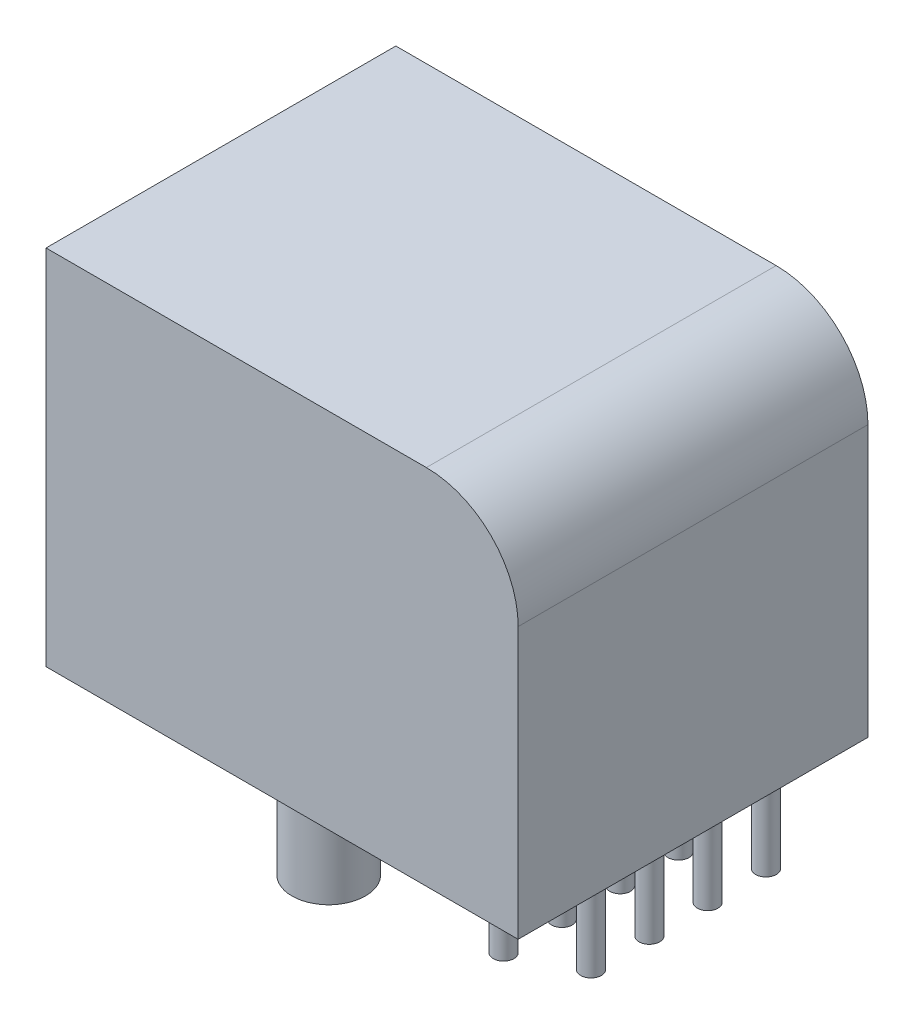
ISO-10303-21;
HEADER;
FILE_DESCRIPTION(('STEP AP214'),'2;1');
FILE_NAME('part.step','',(''),(''),'','','');
FILE_SCHEMA(('AUTOMOTIVE_DESIGN { 1 0 10303 214 1 1 1 1 }'));
ENDSEC;
DATA;
#1=APPLICATION_CONTEXT('core data for automotive mechanical design processes');
#2=APPLICATION_PROTOCOL_DEFINITION('international standard','automotive_design',2000,#1);
#3=PRODUCT_CONTEXT('',#1,'mechanical');
#4=PRODUCT('Part','Part','',(#3));
#5=PRODUCT_RELATED_PRODUCT_CATEGORY('part','',(#4));
#6=PRODUCT_DEFINITION_FORMATION('','',#4);
#7=PRODUCT_DEFINITION_CONTEXT('part definition',#1,'design');
#8=PRODUCT_DEFINITION('design','',#6,#7);
#9=PRODUCT_DEFINITION_SHAPE('','',#8);
#10=(LENGTH_UNIT() NAMED_UNIT(*) SI_UNIT(.MILLI.,.METRE.));
#11=(NAMED_UNIT(*) PLANE_ANGLE_UNIT() SI_UNIT($,.RADIAN.));
#12=(NAMED_UNIT(*) SI_UNIT($,.STERADIAN.) SOLID_ANGLE_UNIT());
#13=UNCERTAINTY_MEASURE_WITH_UNIT(LENGTH_MEASURE(1.E-05),#10,'distance_accuracy_value','');
#14=(GEOMETRIC_REPRESENTATION_CONTEXT(3) GLOBAL_UNCERTAINTY_ASSIGNED_CONTEXT((#13)) GLOBAL_UNIT_ASSIGNED_CONTEXT((#10,
#11,#12)) REPRESENTATION_CONTEXT('',''));
#15=CARTESIAN_POINT('',(0.,0.,0.));
#16=DIRECTION('',(0.,0.,1.));
#17=DIRECTION('',(1.,0.,0.));
#18=AXIS2_PLACEMENT_3D('',#15,#16,#17);
#19=CARTESIAN_POINT('',(-10.285,-7.9,15.24));
#20=DIRECTION('',(-1.,0.,0.));
#21=DIRECTION('',(0.,0.,1.));
#22=AXIS2_PLACEMENT_3D('',#19,#20,#21);
#23=PLANE('',#22);
#24=DIRECTION('',(0.,1.,0.));
#25=VECTOR('',#24,1.);
#26=CARTESIAN_POINT('',(-10.285,-7.9,0.));
#27=LINE('',#26,#25);
#28=CARTESIAN_POINT('',(-10.285,-7.9,0.));
#29=VERTEX_POINT('',#28);
#30=CARTESIAN_POINT('',(-10.285,7.9,0.));
#31=VERTEX_POINT('',#30);
#32=EDGE_CURVE('E119',#29,#31,#27,.T.);
#33=ORIENTED_EDGE('',*,*,#32,.F.);
#34=DIRECTION('',(0.,0.,-1.));
#35=VECTOR('',#34,1.);
#36=CARTESIAN_POINT('',(-10.285,-7.9,15.24));
#37=LINE('',#36,#35);
#38=CARTESIAN_POINT('',(-10.285,-7.9,15.24));
#39=VERTEX_POINT('',#38);
#40=EDGE_CURVE('E107',#39,#29,#37,.T.);
#41=ORIENTED_EDGE('',*,*,#40,.F.);
#42=DIRECTION('',(0.,1.,0.));
#43=VECTOR('',#42,1.);
#44=CARTESIAN_POINT('',(-10.285,-7.9,15.24));
#45=LINE('',#44,#43);
#46=CARTESIAN_POINT('',(-10.285,7.9,15.24));
#47=VERTEX_POINT('',#46);
#48=EDGE_CURVE('E102',#39,#47,#45,.T.);
#49=ORIENTED_EDGE('',*,*,#48,.T.);
#50=DIRECTION('',(0.,0.,-1.));
#51=VECTOR('',#50,1.);
#52=CARTESIAN_POINT('',(-10.285,7.9,15.24));
#53=LINE('',#52,#51);
#54=EDGE_CURVE('E85',#47,#31,#53,.T.);
#55=ORIENTED_EDGE('',*,*,#54,.T.);
#56=EDGE_LOOP('',(#33,#41,#49,#55));
#57=FACE_BOUND('',#56,.T.);
#58=ADVANCED_FACE('F36',(#57),#23,.T.);
#59=CARTESIAN_POINT('',(-10.285,-7.9,15.24));
#60=DIRECTION('',(0.,1.,0.));
#61=DIRECTION('',(0.,0.,1.));
#62=AXIS2_PLACEMENT_3D('',#59,#60,#61);
#63=PLANE('',#62);
#64=CARTESIAN_POINT('',(6.475,-7.9,12.065));
#65=DIRECTION('',(0.,1.,0.));
#66=DIRECTION('',(0.,0.,1.));
#67=AXIS2_PLACEMENT_3D('',#64,#65,#66);
#68=CIRCLE('',#67,0.45);
#69=CARTESIAN_POINT('',(6.475,-7.9,12.515));
#70=VERTEX_POINT('',#69);
#71=EDGE_CURVE('E11',#70,#70,#68,.F.);
#72=ORIENTED_EDGE('',*,*,#71,.F.);
#73=EDGE_LOOP('',(#72));
#74=FACE_BOUND('',#73,.T.);
#75=CARTESIAN_POINT('',(6.475,-7.9,9.525));
#76=DIRECTION('',(0.,1.,0.));
#77=DIRECTION('',(0.,0.,1.));
#78=AXIS2_PLACEMENT_3D('',#75,#76,#77);
#79=CIRCLE('',#78,0.45);
#80=CARTESIAN_POINT('',(6.475,-7.9,9.975));
#81=VERTEX_POINT('',#80);
#82=EDGE_CURVE('E44',#81,#81,#79,.F.);
#83=ORIENTED_EDGE('',*,*,#82,.F.);
#84=EDGE_LOOP('',(#83));
#85=FACE_BOUND('',#84,.T.);
#86=CARTESIAN_POINT('',(6.475,-7.9,4.445));
#87=DIRECTION('',(0.,1.,0.));
#88=DIRECTION('',(0.,0.,1.));
#89=AXIS2_PLACEMENT_3D('',#86,#87,#88);
#90=CIRCLE('',#89,0.45);
#91=CARTESIAN_POINT('',(6.475,-7.9,4.895));
#92=VERTEX_POINT('',#91);
#93=EDGE_CURVE('E152',#92,#92,#90,.F.);
#94=ORIENTED_EDGE('',*,*,#93,.F.);
#95=EDGE_LOOP('',(#94));
#96=FACE_BOUND('',#95,.T.);
#97=CARTESIAN_POINT('',(9.015,-7.9,10.795));
#98=DIRECTION('',(0.,1.,0.));
#99=DIRECTION('',(0.,0.,1.));
#100=AXIS2_PLACEMENT_3D('',#97,#98,#99);
#101=CIRCLE('',#100,0.45);
#102=CARTESIAN_POINT('',(9.015,-7.9,11.245));
#103=VERTEX_POINT('',#102);
#104=EDGE_CURVE('E149',#103,#103,#101,.F.);
#105=ORIENTED_EDGE('',*,*,#104,.F.);
#106=EDGE_LOOP('',(#105));
#107=FACE_BOUND('',#106,.T.);
#108=CARTESIAN_POINT('',(9.015,-7.9,3.175));
#109=DIRECTION('',(0.,1.,0.));
#110=DIRECTION('',(0.,0.,1.));
#111=AXIS2_PLACEMENT_3D('',#108,#109,#110);
#112=CIRCLE('',#111,0.45);
#113=CARTESIAN_POINT('',(9.015,-7.9,3.625));
#114=VERTEX_POINT('',#113);
#115=EDGE_CURVE('E146',#114,#114,#112,.F.);
#116=ORIENTED_EDGE('',*,*,#115,.F.);
#117=EDGE_LOOP('',(#116));
#118=FACE_BOUND('',#117,.T.);
#119=CARTESIAN_POINT('',(9.015,-7.9,5.715));
#120=DIRECTION('',(0.,1.,0.));
#121=DIRECTION('',(0.,0.,1.));
#122=AXIS2_PLACEMENT_3D('',#119,#120,#121);
#123=CIRCLE('',#122,0.45);
#124=CARTESIAN_POINT('',(9.015,-7.9,6.165));
#125=VERTEX_POINT('',#124);
#126=EDGE_CURVE('E143',#125,#125,#123,.F.);
#127=ORIENTED_EDGE('',*,*,#126,.F.);
#128=EDGE_LOOP('',(#127));
#129=FACE_BOUND('',#128,.T.);
#130=CARTESIAN_POINT('',(9.015,-7.9,8.255));
#131=DIRECTION('',(0.,1.,0.));
#132=DIRECTION('',(0.,0.,1.));
#133=AXIS2_PLACEMENT_3D('',#130,#131,#132);
#134=CIRCLE('',#133,0.45);
#135=CARTESIAN_POINT('',(9.015,-7.9,8.705));
#136=VERTEX_POINT('',#135);
#137=EDGE_CURVE('E140',#136,#136,#134,.F.);
#138=ORIENTED_EDGE('',*,*,#137,.F.);
#139=EDGE_LOOP('',(#138));
#140=FACE_BOUND('',#139,.T.);
#141=CARTESIAN_POINT('',(6.475,-7.9,6.985));
#142=DIRECTION('',(0.,1.,0.));
#143=DIRECTION('',(0.,0.,1.));
#144=AXIS2_PLACEMENT_3D('',#141,#142,#143);
#145=CIRCLE('',#144,0.45);
#146=CARTESIAN_POINT('',(6.475,-7.9,7.435));
#147=VERTEX_POINT('',#146);
#148=EDGE_CURVE('E137',#147,#147,#145,.F.);
#149=ORIENTED_EDGE('',*,*,#148,.F.);
#150=EDGE_LOOP('',(#149));
#151=FACE_BOUND('',#150,.T.);
#152=CARTESIAN_POINT('',(0.125000000000002,-7.9,13.335));
#153=DIRECTION('',(0.,1.,0.));
#154=DIRECTION('',(0.,0.,1.));
#155=AXIS2_PLACEMENT_3D('',#152,#153,#154);
#156=CIRCLE('',#155,1.6);
#157=CARTESIAN_POINT('',(0.125000000000002,-7.9,14.935));
#158=VERTEX_POINT('',#157);
#159=EDGE_CURVE('E134',#158,#158,#156,.F.);
#160=ORIENTED_EDGE('',*,*,#159,.F.);
#161=EDGE_LOOP('',(#160));
#162=FACE_BOUND('',#161,.T.);
#163=CARTESIAN_POINT('',(0.125000000000002,-7.9,1.905));
#164=DIRECTION('',(0.,1.,0.));
#165=DIRECTION('',(0.,0.,1.));
#166=AXIS2_PLACEMENT_3D('',#163,#164,#165);
#167=CIRCLE('',#166,1.6);
#168=CARTESIAN_POINT('',(0.125000000000002,-7.9,3.505));
#169=VERTEX_POINT('',#168);
#170=EDGE_CURVE('E131',#169,#169,#167,.F.);
#171=ORIENTED_EDGE('',*,*,#170,.F.);
#172=EDGE_LOOP('',(#171));
#173=FACE_BOUND('',#172,.T.);
#174=DIRECTION('',(1.,0.,0.));
#175=VECTOR('',#174,1.);
#176=CARTESIAN_POINT('',(-10.285,-7.9,0.));
#177=LINE('',#176,#175);
#178=CARTESIAN_POINT('',(10.285,-7.9,0.));
#179=VERTEX_POINT('',#178);
#180=EDGE_CURVE('E109',#29,#179,#177,.T.);
#181=ORIENTED_EDGE('',*,*,#180,.T.);
#182=DIRECTION('',(0.,0.,-1.));
#183=VECTOR('',#182,1.);
#184=CARTESIAN_POINT('',(10.285,-7.9,15.24));
#185=LINE('',#184,#183);
#186=CARTESIAN_POINT('',(10.285,-7.9,15.24));
#187=VERTEX_POINT('',#186);
#188=EDGE_CURVE('E96',#187,#179,#185,.T.);
#189=ORIENTED_EDGE('',*,*,#188,.F.);
#190=DIRECTION('',(1.,0.,0.));
#191=VECTOR('',#190,1.);
#192=CARTESIAN_POINT('',(-10.285,-7.9,15.24));
#193=LINE('',#192,#191);
#194=EDGE_CURVE('E97',#39,#187,#193,.T.);
#195=ORIENTED_EDGE('',*,*,#194,.F.);
#196=ORIENTED_EDGE('',*,*,#40,.T.);
#197=EDGE_LOOP('',(#181,#189,#195,#196));
#198=FACE_BOUND('',#197,.T.);
#199=ADVANCED_FACE('F159',(#74,#85,#96,#107,#118,#129,#140,#151,#162,#173,#198),#63,.F.);
#200=CARTESIAN_POINT('',(10.285,-7.9,15.24));
#201=DIRECTION('',(-1.,0.,0.));
#202=DIRECTION('',(0.,0.,1.));
#203=AXIS2_PLACEMENT_3D('',#200,#201,#202);
#204=PLANE('',#203);
#205=DIRECTION('',(0.,1.,0.));
#206=VECTOR('',#205,1.);
#207=CARTESIAN_POINT('',(10.285,-7.9,0.));
#208=LINE('',#207,#206);
#209=CARTESIAN_POINT('',(10.285,3.9,0.));
#210=VERTEX_POINT('',#209);
#211=EDGE_CURVE('E111',#179,#210,#208,.T.);
#212=ORIENTED_EDGE('',*,*,#211,.T.);
#213=DIRECTION('',(0.,0.,-1.));
#214=VECTOR('',#213,1.);
#215=CARTESIAN_POINT('',(10.285,3.9,15.24));
#216=LINE('',#215,#214);
#217=CARTESIAN_POINT('',(10.285,3.9,15.24));
#218=VERTEX_POINT('',#217);
#219=EDGE_CURVE('E51',#210,#218,#216,.F.);
#220=ORIENTED_EDGE('',*,*,#219,.T.);
#221=DIRECTION('',(0.,1.,0.));
#222=VECTOR('',#221,1.);
#223=CARTESIAN_POINT('',(10.285,-7.9,15.24));
#224=LINE('',#223,#222);
#225=EDGE_CURVE('E105',#187,#218,#224,.T.);
#226=ORIENTED_EDGE('',*,*,#225,.F.);
#227=ORIENTED_EDGE('',*,*,#188,.T.);
#228=EDGE_LOOP('',(#212,#220,#226,#227));
#229=FACE_BOUND('',#228,.T.);
#230=ADVANCED_FACE('F162',(#229),#204,.F.);
#231=CARTESIAN_POINT('',(-10.285,7.9,15.24));
#232=DIRECTION('',(0.,1.,0.));
#233=DIRECTION('',(0.,0.,1.));
#234=AXIS2_PLACEMENT_3D('',#231,#232,#233);
#235=PLANE('',#234);
#236=DIRECTION('',(1.,0.,0.));
#237=VECTOR('',#236,1.);
#238=CARTESIAN_POINT('',(-10.285,7.9,15.24));
#239=LINE('',#238,#237);
#240=CARTESIAN_POINT('',(6.285,7.9,15.24));
#241=VERTEX_POINT('',#240);
#242=EDGE_CURVE('E89',#47,#241,#239,.T.);
#243=ORIENTED_EDGE('',*,*,#242,.T.);
#244=DIRECTION('',(0.,0.,-1.));
#245=VECTOR('',#244,1.);
#246=CARTESIAN_POINT('',(6.285,7.9,0.));
#247=LINE('',#246,#245);
#248=CARTESIAN_POINT('',(6.285,7.9,0.));
#249=VERTEX_POINT('',#248);
#250=EDGE_CURVE('E124',#241,#249,#247,.T.);
#251=ORIENTED_EDGE('',*,*,#250,.T.);
#252=DIRECTION('',(1.,0.,0.));
#253=VECTOR('',#252,1.);
#254=CARTESIAN_POINT('',(-10.285,7.9,0.));
#255=LINE('',#254,#253);
#256=EDGE_CURVE('E91',#31,#249,#255,.T.);
#257=ORIENTED_EDGE('',*,*,#256,.F.);
#258=ORIENTED_EDGE('',*,*,#54,.F.);
#259=EDGE_LOOP('',(#243,#251,#257,#258));
#260=FACE_BOUND('',#259,.T.);
#261=ADVANCED_FACE('F87',(#260),#235,.T.);
#262=CARTESIAN_POINT('',(0.,0.,15.24));
#263=DIRECTION('',(0.,0.,-1.));
#264=DIRECTION('',(-1.,0.,0.));
#265=AXIS2_PLACEMENT_3D('',#262,#263,#264);
#266=PLANE('',#265);
#267=ORIENTED_EDGE('',*,*,#225,.T.);
#268=CARTESIAN_POINT('',(6.285,3.9,15.24));
#269=DIRECTION('',(0.,0.,-1.));
#270=DIRECTION('',(-1.,0.,0.));
#271=AXIS2_PLACEMENT_3D('',#268,#269,#270);
#272=CIRCLE('',#271,4.);
#273=EDGE_CURVE('E104',#218,#241,#272,.F.);
#274=ORIENTED_EDGE('',*,*,#273,.T.);
#275=ORIENTED_EDGE('',*,*,#242,.F.);
#276=ORIENTED_EDGE('',*,*,#48,.F.);
#277=ORIENTED_EDGE('',*,*,#194,.T.);
#278=EDGE_LOOP('',(#267,#274,#275,#276,#277));
#279=FACE_BOUND('',#278,.T.);
#280=ADVANCED_FACE('F101',(#279),#266,.F.);
#281=CARTESIAN_POINT('',(0.,0.,0.));
#282=DIRECTION('',(0.,0.,-1.));
#283=DIRECTION('',(-1.,0.,0.));
#284=AXIS2_PLACEMENT_3D('',#281,#282,#283);
#285=PLANE('',#284);
#286=ORIENTED_EDGE('',*,*,#256,.T.);
#287=CARTESIAN_POINT('',(6.285,3.9,0.));
#288=DIRECTION('',(0.,0.,-1.));
#289=DIRECTION('',(-1.,0.,0.));
#290=AXIS2_PLACEMENT_3D('',#287,#288,#289);
#291=CIRCLE('',#290,4.);
#292=EDGE_CURVE('E59',#249,#210,#291,.T.);
#293=ORIENTED_EDGE('',*,*,#292,.T.);
#294=ORIENTED_EDGE('',*,*,#211,.F.);
#295=ORIENTED_EDGE('',*,*,#180,.F.);
#296=ORIENTED_EDGE('',*,*,#32,.T.);
#297=EDGE_LOOP('',(#286,#293,#294,#295,#296));
#298=FACE_BOUND('',#297,.T.);
#299=ADVANCED_FACE('F183',(#298),#285,.T.);
#300=CARTESIAN_POINT('',(6.285,3.9,15.24));
#301=DIRECTION('',(0.,0.,1.));
#302=DIRECTION('',(1.,0.,0.));
#303=AXIS2_PLACEMENT_3D('',#300,#301,#302);
#304=CYLINDRICAL_SURFACE('',#303,4.);
#305=ORIENTED_EDGE('',*,*,#273,.F.);
#306=ORIENTED_EDGE('',*,*,#219,.F.);
#307=ORIENTED_EDGE('',*,*,#292,.F.);
#308=ORIENTED_EDGE('',*,*,#250,.F.);
#309=EDGE_LOOP('',(#305,#306,#307,#308));
#310=FACE_BOUND('',#309,.T.);
#311=ADVANCED_FACE('F38',(#310),#304,.T.);
#312=CARTESIAN_POINT('',(0.125000000000002,-11.5,1.905));
#313=DIRECTION('',(0.,1.,0.));
#314=DIRECTION('',(0.,0.,1.));
#315=AXIS2_PLACEMENT_3D('',#312,#313,#314);
#316=CYLINDRICAL_SURFACE('',#315,1.6);
#317=CARTESIAN_POINT('',(0.125000000000002,-11.5,1.905));
#318=DIRECTION('',(0.,-1.,0.));
#319=DIRECTION('',(0.,0.,-1.));
#320=AXIS2_PLACEMENT_3D('',#317,#318,#319);
#321=CIRCLE('',#320,1.6);
#322=CARTESIAN_POINT('',(0.125000000000002,-11.5,0.305));
#323=VERTEX_POINT('',#322);
#324=EDGE_CURVE('E114',#323,#323,#321,.T.);
#325=ORIENTED_EDGE('',*,*,#324,.F.);
#326=EDGE_LOOP('',(#325));
#327=FACE_BOUND('',#326,.T.);
#328=ORIENTED_EDGE('',*,*,#170,.T.);
#329=EDGE_LOOP('',(#328));
#330=FACE_BOUND('',#329,.T.);
#331=ADVANCED_FACE('F190',(#327,#330),#316,.T.);
#332=CARTESIAN_POINT('',(0.,-11.5,0.));
#333=DIRECTION('',(0.,-1.,0.));
#334=DIRECTION('',(0.,0.,-1.));
#335=AXIS2_PLACEMENT_3D('',#332,#333,#334);
#336=PLANE('',#335);
#337=ORIENTED_EDGE('',*,*,#324,.T.);
#338=EDGE_LOOP('',(#337));
#339=FACE_BOUND('',#338,.T.);
#340=ADVANCED_FACE('F231',(#339),#336,.T.);
#341=CARTESIAN_POINT('',(0.125000000000002,-11.5,13.335));
#342=DIRECTION('',(0.,1.,0.));
#343=DIRECTION('',(0.,0.,1.));
#344=AXIS2_PLACEMENT_3D('',#341,#342,#343);
#345=CYLINDRICAL_SURFACE('',#344,1.6);
#346=CARTESIAN_POINT('',(0.125000000000002,-11.5,13.335));
#347=DIRECTION('',(0.,-1.,0.));
#348=DIRECTION('',(0.,0.,-1.));
#349=AXIS2_PLACEMENT_3D('',#346,#347,#348);
#350=CIRCLE('',#349,1.6);
#351=CARTESIAN_POINT('',(0.125000000000002,-11.5,11.735));
#352=VERTEX_POINT('',#351);
#353=EDGE_CURVE('E478',#352,#352,#350,.T.);
#354=ORIENTED_EDGE('',*,*,#353,.F.);
#355=EDGE_LOOP('',(#354));
#356=FACE_BOUND('',#355,.T.);
#357=ORIENTED_EDGE('',*,*,#159,.T.);
#358=EDGE_LOOP('',(#357));
#359=FACE_BOUND('',#358,.T.);
#360=ADVANCED_FACE('F241',(#356,#359),#345,.T.);
#361=CARTESIAN_POINT('',(0.125000000000002,-11.5,13.335));
#362=DIRECTION('',(0.,-1.,0.));
#363=DIRECTION('',(0.,0.,-1.));
#364=AXIS2_PLACEMENT_3D('',#361,#362,#363);
#365=PLANE('',#364);
#366=ORIENTED_EDGE('',*,*,#353,.T.);
#367=EDGE_LOOP('',(#366));
#368=FACE_BOUND('',#367,.T.);
#369=ADVANCED_FACE('F251',(#368),#365,.T.);
#370=CARTESIAN_POINT('',(6.475,-11.9,6.985));
#371=DIRECTION('',(0.,1.,0.));
#372=DIRECTION('',(0.,0.,1.));
#373=AXIS2_PLACEMENT_3D('',#370,#371,#372);
#374=CYLINDRICAL_SURFACE('',#373,0.45);
#375=CARTESIAN_POINT('',(6.475,-11.9,6.985));
#376=DIRECTION('',(0.,-1.,0.));
#377=DIRECTION('',(0.,0.,-1.));
#378=AXIS2_PLACEMENT_3D('',#375,#376,#377);
#379=CIRCLE('',#378,0.45);
#380=CARTESIAN_POINT('',(6.475,-11.9,6.535));
#381=VERTEX_POINT('',#380);
#382=EDGE_CURVE('E476',#381,#381,#379,.T.);
#383=ORIENTED_EDGE('',*,*,#382,.F.);
#384=EDGE_LOOP('',(#383));
#385=FACE_BOUND('',#384,.T.);
#386=ORIENTED_EDGE('',*,*,#148,.T.);
#387=EDGE_LOOP('',(#386));
#388=FACE_BOUND('',#387,.T.);
#389=ADVANCED_FACE('F261',(#385,#388),#374,.T.);
#390=CARTESIAN_POINT('',(0.,-11.9,0.));
#391=DIRECTION('',(0.,-1.,0.));
#392=DIRECTION('',(0.,0.,-1.));
#393=AXIS2_PLACEMENT_3D('',#390,#391,#392);
#394=PLANE('',#393);
#395=ORIENTED_EDGE('',*,*,#382,.T.);
#396=EDGE_LOOP('',(#395));
#397=FACE_BOUND('',#396,.T.);
#398=ADVANCED_FACE('F271',(#397),#394,.T.);
#399=CARTESIAN_POINT('',(9.015,-11.9,8.255));
#400=DIRECTION('',(0.,1.,0.));
#401=DIRECTION('',(0.,0.,1.));
#402=AXIS2_PLACEMENT_3D('',#399,#400,#401);
#403=CYLINDRICAL_SURFACE('',#402,0.45);
#404=CARTESIAN_POINT('',(9.015,-11.9,8.255));
#405=DIRECTION('',(0.,-1.,0.));
#406=DIRECTION('',(0.,0.,-1.));
#407=AXIS2_PLACEMENT_3D('',#404,#405,#406);
#408=CIRCLE('',#407,0.45);
#409=CARTESIAN_POINT('',(9.015,-11.9,7.805));
#410=VERTEX_POINT('',#409);
#411=EDGE_CURVE('E473',#410,#410,#408,.T.);
#412=ORIENTED_EDGE('',*,*,#411,.F.);
#413=EDGE_LOOP('',(#412));
#414=FACE_BOUND('',#413,.T.);
#415=ORIENTED_EDGE('',*,*,#137,.T.);
#416=EDGE_LOOP('',(#415));
#417=FACE_BOUND('',#416,.T.);
#418=ADVANCED_FACE('F281',(#414,#417),#403,.T.);
#419=CARTESIAN_POINT('',(9.015,-11.9,8.255));
#420=DIRECTION('',(0.,-1.,0.));
#421=DIRECTION('',(0.,0.,-1.));
#422=AXIS2_PLACEMENT_3D('',#419,#420,#421);
#423=PLANE('',#422);
#424=ORIENTED_EDGE('',*,*,#411,.T.);
#425=EDGE_LOOP('',(#424));
#426=FACE_BOUND('',#425,.T.);
#427=ADVANCED_FACE('F291',(#426),#423,.T.);
#428=CARTESIAN_POINT('',(9.015,-11.9,5.715));
#429=DIRECTION('',(0.,1.,0.));
#430=DIRECTION('',(0.,0.,1.));
#431=AXIS2_PLACEMENT_3D('',#428,#429,#430);
#432=CYLINDRICAL_SURFACE('',#431,0.45);
#433=CARTESIAN_POINT('',(9.015,-11.9,5.715));
#434=DIRECTION('',(0.,-1.,0.));
#435=DIRECTION('',(0.,0.,-1.));
#436=AXIS2_PLACEMENT_3D('',#433,#434,#435);
#437=CIRCLE('',#436,0.45);
#438=CARTESIAN_POINT('',(9.015,-11.9,5.265));
#439=VERTEX_POINT('',#438);
#440=EDGE_CURVE('E470',#439,#439,#437,.T.);
#441=ORIENTED_EDGE('',*,*,#440,.F.);
#442=EDGE_LOOP('',(#441));
#443=FACE_BOUND('',#442,.T.);
#444=ORIENTED_EDGE('',*,*,#126,.T.);
#445=EDGE_LOOP('',(#444));
#446=FACE_BOUND('',#445,.T.);
#447=ADVANCED_FACE('F301',(#443,#446),#432,.T.);
#448=CARTESIAN_POINT('',(9.015,-11.9,5.715));
#449=DIRECTION('',(0.,-1.,0.));
#450=DIRECTION('',(0.,0.,-1.));
#451=AXIS2_PLACEMENT_3D('',#448,#449,#450);
#452=PLANE('',#451);
#453=ORIENTED_EDGE('',*,*,#440,.T.);
#454=EDGE_LOOP('',(#453));
#455=FACE_BOUND('',#454,.T.);
#456=ADVANCED_FACE('F312',(#455),#452,.T.);
#457=CARTESIAN_POINT('',(9.015,-11.9,3.175));
#458=DIRECTION('',(0.,1.,0.));
#459=DIRECTION('',(0.,0.,1.));
#460=AXIS2_PLACEMENT_3D('',#457,#458,#459);
#461=CYLINDRICAL_SURFACE('',#460,0.45);
#462=CARTESIAN_POINT('',(9.015,-11.9,3.175));
#463=DIRECTION('',(0.,-1.,0.));
#464=DIRECTION('',(0.,0.,-1.));
#465=AXIS2_PLACEMENT_3D('',#462,#463,#464);
#466=CIRCLE('',#465,0.45);
#467=CARTESIAN_POINT('',(9.015,-11.9,2.725));
#468=VERTEX_POINT('',#467);
#469=EDGE_CURVE('E467',#468,#468,#466,.T.);
#470=ORIENTED_EDGE('',*,*,#469,.F.);
#471=EDGE_LOOP('',(#470));
#472=FACE_BOUND('',#471,.T.);
#473=ORIENTED_EDGE('',*,*,#115,.T.);
#474=EDGE_LOOP('',(#473));
#475=FACE_BOUND('',#474,.T.);
#476=ADVANCED_FACE('F325',(#472,#475),#461,.T.);
#477=CARTESIAN_POINT('',(9.015,-11.9,3.175));
#478=DIRECTION('',(0.,-1.,0.));
#479=DIRECTION('',(0.,0.,-1.));
#480=AXIS2_PLACEMENT_3D('',#477,#478,#479);
#481=PLANE('',#480);
#482=ORIENTED_EDGE('',*,*,#469,.T.);
#483=EDGE_LOOP('',(#482));
#484=FACE_BOUND('',#483,.T.);
#485=ADVANCED_FACE('F336',(#484),#481,.T.);
#486=CARTESIAN_POINT('',(9.015,-11.9,10.795));
#487=DIRECTION('',(0.,1.,0.));
#488=DIRECTION('',(0.,0.,1.));
#489=AXIS2_PLACEMENT_3D('',#486,#487,#488);
#490=CYLINDRICAL_SURFACE('',#489,0.45);
#491=CARTESIAN_POINT('',(9.015,-11.9,10.795));
#492=DIRECTION('',(0.,-1.,0.));
#493=DIRECTION('',(0.,0.,-1.));
#494=AXIS2_PLACEMENT_3D('',#491,#492,#493);
#495=CIRCLE('',#494,0.45);
#496=CARTESIAN_POINT('',(9.015,-11.9,10.345));
#497=VERTEX_POINT('',#496);
#498=EDGE_CURVE('E464',#497,#497,#495,.T.);
#499=ORIENTED_EDGE('',*,*,#498,.F.);
#500=EDGE_LOOP('',(#499));
#501=FACE_BOUND('',#500,.T.);
#502=ORIENTED_EDGE('',*,*,#104,.T.);
#503=EDGE_LOOP('',(#502));
#504=FACE_BOUND('',#503,.T.);
#505=ADVANCED_FACE('F347',(#501,#504),#490,.T.);
#506=CARTESIAN_POINT('',(9.015,-11.9,10.795));
#507=DIRECTION('',(0.,-1.,0.));
#508=DIRECTION('',(0.,0.,-1.));
#509=AXIS2_PLACEMENT_3D('',#506,#507,#508);
#510=PLANE('',#509);
#511=ORIENTED_EDGE('',*,*,#498,.T.);
#512=EDGE_LOOP('',(#511));
#513=FACE_BOUND('',#512,.T.);
#514=ADVANCED_FACE('F357',(#513),#510,.T.);
#515=CARTESIAN_POINT('',(6.475,-11.9,4.445));
#516=DIRECTION('',(0.,1.,0.));
#517=DIRECTION('',(0.,0.,1.));
#518=AXIS2_PLACEMENT_3D('',#515,#516,#517);
#519=CYLINDRICAL_SURFACE('',#518,0.45);
#520=CARTESIAN_POINT('',(6.475,-11.9,4.445));
#521=DIRECTION('',(0.,-1.,0.));
#522=DIRECTION('',(0.,0.,-1.));
#523=AXIS2_PLACEMENT_3D('',#520,#521,#522);
#524=CIRCLE('',#523,0.45);
#525=CARTESIAN_POINT('',(6.475,-11.9,3.995));
#526=VERTEX_POINT('',#525);
#527=EDGE_CURVE('E459',#526,#526,#524,.T.);
#528=ORIENTED_EDGE('',*,*,#527,.F.);
#529=EDGE_LOOP('',(#528));
#530=FACE_BOUND('',#529,.T.);
#531=ORIENTED_EDGE('',*,*,#93,.T.);
#532=EDGE_LOOP('',(#531));
#533=FACE_BOUND('',#532,.T.);
#534=ADVANCED_FACE('F367',(#530,#533),#519,.T.);
#535=CARTESIAN_POINT('',(0.,-11.9,-2.54));
#536=DIRECTION('',(0.,-1.,0.));
#537=DIRECTION('',(0.,0.,-1.));
#538=AXIS2_PLACEMENT_3D('',#535,#536,#537);
#539=PLANE('',#538);
#540=ORIENTED_EDGE('',*,*,#527,.T.);
#541=EDGE_LOOP('',(#540));
#542=FACE_BOUND('',#541,.T.);
#543=ADVANCED_FACE('F384',(#542),#539,.T.);
#544=CARTESIAN_POINT('',(6.475,-11.9,9.525));
#545=DIRECTION('',(0.,1.,0.));
#546=DIRECTION('',(0.,0.,1.));
#547=AXIS2_PLACEMENT_3D('',#544,#545,#546);
#548=CYLINDRICAL_SURFACE('',#547,0.45);
#549=CARTESIAN_POINT('',(6.475,-11.9,9.525));
#550=DIRECTION('',(0.,-1.,0.));
#551=DIRECTION('',(0.,0.,-1.));
#552=AXIS2_PLACEMENT_3D('',#549,#550,#551);
#553=CIRCLE('',#552,0.45);
#554=CARTESIAN_POINT('',(6.475,-11.9,9.075));
#555=VERTEX_POINT('',#554);
#556=EDGE_CURVE('E456',#555,#555,#553,.T.);
#557=ORIENTED_EDGE('',*,*,#556,.F.);
#558=EDGE_LOOP('',(#557));
#559=FACE_BOUND('',#558,.T.);
#560=ORIENTED_EDGE('',*,*,#82,.T.);
#561=EDGE_LOOP('',(#560));
#562=FACE_BOUND('',#561,.T.);
#563=ADVANCED_FACE('F157',(#559,#562),#548,.T.);
#564=CARTESIAN_POINT('',(0.,-11.9,2.54));
#565=DIRECTION('',(0.,-1.,0.));
#566=DIRECTION('',(0.,0.,-1.));
#567=AXIS2_PLACEMENT_3D('',#564,#565,#566);
#568=PLANE('',#567);
#569=ORIENTED_EDGE('',*,*,#556,.T.);
#570=EDGE_LOOP('',(#569));
#571=FACE_BOUND('',#570,.T.);
#572=ADVANCED_FACE('F406',(#571),#568,.T.);
#573=CARTESIAN_POINT('',(6.475,-11.9,12.065));
#574=DIRECTION('',(0.,1.,0.));
#575=DIRECTION('',(0.,0.,1.));
#576=AXIS2_PLACEMENT_3D('',#573,#574,#575);
#577=CYLINDRICAL_SURFACE('',#576,0.45);
#578=CARTESIAN_POINT('',(6.475,-11.9,12.065));
#579=DIRECTION('',(0.,-1.,0.));
#580=DIRECTION('',(0.,0.,-1.));
#581=AXIS2_PLACEMENT_3D('',#578,#579,#580);
#582=CIRCLE('',#581,0.45);
#583=CARTESIAN_POINT('',(6.475,-11.9,11.615));
#584=VERTEX_POINT('',#583);
#585=EDGE_CURVE('E455',#584,#584,#582,.T.);
#586=ORIENTED_EDGE('',*,*,#585,.F.);
#587=EDGE_LOOP('',(#586));
#588=FACE_BOUND('',#587,.T.);
#589=ORIENTED_EDGE('',*,*,#71,.T.);
#590=EDGE_LOOP('',(#589));
#591=FACE_BOUND('',#590,.T.);
#592=ADVANCED_FACE('F417',(#588,#591),#577,.T.);
#593=CARTESIAN_POINT('',(0.,-11.9,5.08));
#594=DIRECTION('',(0.,-1.,0.));
#595=DIRECTION('',(0.,0.,-1.));
#596=AXIS2_PLACEMENT_3D('',#593,#594,#595);
#597=PLANE('',#596);
#598=ORIENTED_EDGE('',*,*,#585,.T.);
#599=EDGE_LOOP('',(#598));
#600=FACE_BOUND('',#599,.T.);
#601=ADVANCED_FACE('F427',(#600),#597,.T.);
#602=CLOSED_SHELL('',(#58,#199,#230,#261,#280,#299,#311,#331,#340,#360,#369,#389,#398,#418,#427,
#447,#456,#476,#485,#505,#514,#534,#543,#563,#572,#592,#601));
#603=MANIFOLD_SOLID_BREP('B2',#602);
#604=ADVANCED_BREP_SHAPE_REPRESENTATION('',(#18,#603),#14);
#605=SHAPE_DEFINITION_REPRESENTATION(#9,#604);
ENDSEC;
END-ISO-10303-21;
